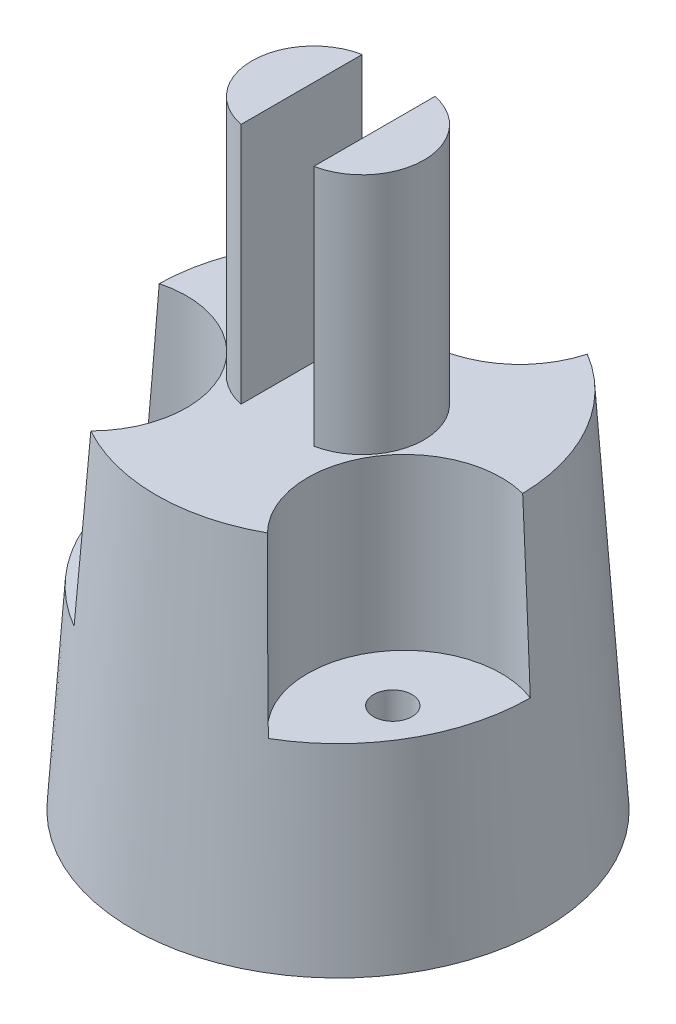
ISO-10303-21;
HEADER;
FILE_DESCRIPTION(('STEP AP214'),'2;1');
FILE_NAME('part.step','',(''),(''),'','','');
FILE_SCHEMA(('AUTOMOTIVE_DESIGN { 1 0 10303 214 1 1 1 1 }'));
ENDSEC;
DATA;
#1=APPLICATION_CONTEXT('core data for automotive mechanical design processes');
#2=APPLICATION_PROTOCOL_DEFINITION('international standard','automotive_design',2000,#1);
#3=PRODUCT_CONTEXT('',#1,'mechanical');
#4=PRODUCT('Part','Part','',(#3));
#5=PRODUCT_RELATED_PRODUCT_CATEGORY('part','',(#4));
#6=PRODUCT_DEFINITION_FORMATION('','',#4);
#7=PRODUCT_DEFINITION_CONTEXT('part definition',#1,'design');
#8=PRODUCT_DEFINITION('design','',#6,#7);
#9=PRODUCT_DEFINITION_SHAPE('','',#8);
#10=(LENGTH_UNIT() NAMED_UNIT(*) SI_UNIT(.MILLI.,.METRE.));
#11=(NAMED_UNIT(*) PLANE_ANGLE_UNIT() SI_UNIT($,.RADIAN.));
#12=(NAMED_UNIT(*) SI_UNIT($,.STERADIAN.) SOLID_ANGLE_UNIT());
#13=UNCERTAINTY_MEASURE_WITH_UNIT(LENGTH_MEASURE(1.E-05),#10,'distance_accuracy_value','');
#14=(GEOMETRIC_REPRESENTATION_CONTEXT(3) GLOBAL_UNCERTAINTY_ASSIGNED_CONTEXT((#13)) GLOBAL_UNIT_ASSIGNED_CONTEXT((#10,
#11,#12)) REPRESENTATION_CONTEXT('',''));
#15=CARTESIAN_POINT('',(0.,0.,0.));
#16=DIRECTION('',(0.,0.,1.));
#17=DIRECTION('',(1.,0.,0.));
#18=AXIS2_PLACEMENT_3D('',#15,#16,#17);
#19=CARTESIAN_POINT('',(3.5,15.,0.));
#20=DIRECTION('',(0.,-1.,0.));
#21=DIRECTION('',(1.,0.,0.));
#22=AXIS2_PLACEMENT_3D('',#19,#20,#21);
#23=PLANE('',#22);
#24=CARTESIAN_POINT('',(1.,15.,0.));
#25=DIRECTION('',(0.,1.,0.));
#26=DIRECTION('',(-1.,0.,0.));
#27=AXIS2_PLACEMENT_3D('',#24,#25,#26);
#28=CIRCLE('',#27,2.54950975679639);
#29=CARTESIAN_POINT('',(1.5,15.,2.5));
#30=VERTEX_POINT('',#29);
#31=CARTESIAN_POINT('',(1.5,15.,-2.5));
#32=VERTEX_POINT('',#31);
#33=EDGE_CURVE('E140',#30,#32,#28,.T.);
#34=ORIENTED_EDGE('',*,*,#33,.F.);
#35=DIRECTION('',(0.,0.,1.));
#36=VECTOR('',#35,1.);
#37=CARTESIAN_POINT('',(1.5,15.,-2.5));
#38=LINE('',#37,#36);
#39=EDGE_CURVE('E65',#32,#30,#38,.T.);
#40=ORIENTED_EDGE('',*,*,#39,.F.);
#41=EDGE_LOOP('',(#34,#40));
#42=FACE_BOUND('',#41,.T.);
#43=CARTESIAN_POINT('',(0.,15.,0.));
#44=DIRECTION('',(0.,1.,0.));
#45=DIRECTION('',(-1.,0.,0.));
#46=AXIS2_PLACEMENT_3D('',#43,#44,#45);
#47=CIRCLE('',#46,7.50000000000001);
#48=CARTESIAN_POINT('',(7.49900773698669,15.,-0.121995740146375));
#49=VERTEX_POINT('',#48);
#50=CARTESIAN_POINT('',(3.85515527861359,15.,-6.43333333333334));
#51=VERTEX_POINT('',#50);
#52=EDGE_CURVE('E243',#49,#51,#47,.T.);
#53=ORIENTED_EDGE('',*,*,#52,.T.);
#54=CARTESIAN_POINT('',(0.,15.,-7.5));
#55=DIRECTION('',(0.,1.,0.));
#56=DIRECTION('',(-1.,0.,0.));
#57=AXIS2_PLACEMENT_3D('',#54,#55,#56);
#58=CIRCLE('',#57,4.);
#59=CARTESIAN_POINT('',(-3.85515527861359,15.,-6.43333333333334));
#60=VERTEX_POINT('',#59);
#61=EDGE_CURVE('E171',#60,#51,#58,.T.);
#62=ORIENTED_EDGE('',*,*,#61,.F.);
#63=CARTESIAN_POINT('',(-7.49900773698669,15.,-0.121995740146375));
#64=VERTEX_POINT('',#63);
#65=EDGE_CURVE('E254',#60,#64,#47,.T.);
#66=ORIENTED_EDGE('',*,*,#65,.T.);
#67=CARTESIAN_POINT('',(-6.49519052838329,15.,3.75));
#68=DIRECTION('',(0.,1.,0.));
#69=DIRECTION('',(-1.,0.,0.));
#70=AXIS2_PLACEMENT_3D('',#67,#68,#69);
#71=CIRCLE('',#70,4.);
#72=CARTESIAN_POINT('',(-3.6438524583731,15.,6.55532907347972));
#73=VERTEX_POINT('',#72);
#74=EDGE_CURVE('E165',#73,#64,#71,.T.);
#75=ORIENTED_EDGE('',*,*,#74,.F.);
#76=CARTESIAN_POINT('',(3.6438524583731,15.,6.55532907347972));
#77=VERTEX_POINT('',#76);
#78=EDGE_CURVE('E51',#73,#77,#47,.T.);
#79=ORIENTED_EDGE('',*,*,#78,.T.);
#80=CARTESIAN_POINT('',(6.49519052838329,15.,3.75));
#81=DIRECTION('',(0.,1.,0.));
#82=DIRECTION('',(-1.,0.,0.));
#83=AXIS2_PLACEMENT_3D('',#80,#81,#82);
#84=CIRCLE('',#83,4.);
#85=EDGE_CURVE('E178',#49,#77,#84,.T.);
#86=ORIENTED_EDGE('',*,*,#85,.F.);
#87=EDGE_LOOP('',(#53,#62,#66,#75,#79,#86));
#88=FACE_BOUND('',#87,.T.);
#89=CARTESIAN_POINT('',(-1.,15.,0.));
#90=DIRECTION('',(0.,1.,0.));
#91=DIRECTION('',(1.,0.,0.));
#92=AXIS2_PLACEMENT_3D('',#89,#90,#91);
#93=CIRCLE('',#92,2.54950975679639);
#94=CARTESIAN_POINT('',(-1.5,15.,-2.5));
#95=VERTEX_POINT('',#94);
#96=CARTESIAN_POINT('',(-1.5,15.,2.5));
#97=VERTEX_POINT('',#96);
#98=EDGE_CURVE('E138',#95,#97,#93,.T.);
#99=ORIENTED_EDGE('',*,*,#98,.F.);
#100=DIRECTION('',(0.,0.,-1.));
#101=VECTOR('',#100,1.);
#102=CARTESIAN_POINT('',(-1.5,15.,-2.5));
#103=LINE('',#102,#101);
#104=EDGE_CURVE('E58',#97,#95,#103,.T.);
#105=ORIENTED_EDGE('',*,*,#104,.F.);
#106=EDGE_LOOP('',(#99,#105));
#107=FACE_BOUND('',#106,.T.);
#108=ADVANCED_FACE('F41',(#42,#88,#107),#23,.F.);
#109=CARTESIAN_POINT('',(0.0193509079697166,15.001,-6.24837003564615));
#110=DIRECTION('',(0.,-1.,0.));
#111=DIRECTION('',(1.,0.,0.));
#112=AXIS2_PLACEMENT_3D('',#109,#110,#111);
#113=CYLINDRICAL_SURFACE('',#112,0.793750000000001);
#114=CARTESIAN_POINT('',(0.0193509079697163,0.,-6.24837003564615));
#115=DIRECTION('',(0.,-1.,0.));
#116=DIRECTION('',(1.,0.,0.));
#117=AXIS2_PLACEMENT_3D('',#114,#115,#116);
#118=CIRCLE('',#117,0.793750000000001);
#119=CARTESIAN_POINT('',(0.813100907969717,0.,-6.24837003564615));
#120=VERTEX_POINT('',#119);
#121=EDGE_CURVE('E260',#120,#120,#118,.T.);
#122=ORIENTED_EDGE('',*,*,#121,.T.);
#123=EDGE_LOOP('',(#122));
#124=FACE_BOUND('',#123,.T.);
#125=CARTESIAN_POINT('',(0.0193509079697165,8.,-6.24837003564615));
#126=DIRECTION('',(0.,1.,0.));
#127=DIRECTION('',(-1.,0.,0.));
#128=AXIS2_PLACEMENT_3D('',#125,#126,#127);
#129=CIRCLE('',#128,0.793750000000001);
#130=CARTESIAN_POINT('',(-0.774399092030284,8.,-6.24837003564615));
#131=VERTEX_POINT('',#130);
#132=EDGE_CURVE('E45',#131,#131,#129,.F.);
#133=ORIENTED_EDGE('',*,*,#132,.F.);
#134=EDGE_LOOP('',(#133));
#135=FACE_BOUND('',#134,.T.);
#136=ADVANCED_FACE('F231',(#124,#135),#113,.F.);
#137=CARTESIAN_POINT('',(5.40157172913021,15.001,3.1409433957111));
#138=DIRECTION('',(0.,-1.,0.));
#139=DIRECTION('',(1.,0.,0.));
#140=AXIS2_PLACEMENT_3D('',#137,#138,#139);
#141=CYLINDRICAL_SURFACE('',#140,0.79375);
#142=CARTESIAN_POINT('',(5.40157172913021,0.,3.1409433957111));
#143=DIRECTION('',(0.,-1.,0.));
#144=DIRECTION('',(1.,0.,0.));
#145=AXIS2_PLACEMENT_3D('',#142,#143,#144);
#146=CIRCLE('',#145,0.79375);
#147=CARTESIAN_POINT('',(6.19532172913021,0.,3.1409433957111));
#148=VERTEX_POINT('',#147);
#149=EDGE_CURVE('E323',#148,#148,#146,.T.);
#150=ORIENTED_EDGE('',*,*,#149,.T.);
#151=EDGE_LOOP('',(#150));
#152=FACE_BOUND('',#151,.T.);
#153=CARTESIAN_POINT('',(5.40157172913021,8.,3.1409433957111));
#154=DIRECTION('',(0.,1.,0.));
#155=DIRECTION('',(-1.,0.,0.));
#156=AXIS2_PLACEMENT_3D('',#153,#154,#155);
#157=CIRCLE('',#156,0.79375);
#158=CARTESIAN_POINT('',(4.60782172913021,8.,3.1409433957111));
#159=VERTEX_POINT('',#158);
#160=EDGE_CURVE('E190',#159,#159,#157,.F.);
#161=ORIENTED_EDGE('',*,*,#160,.F.);
#162=EDGE_LOOP('',(#161));
#163=FACE_BOUND('',#162,.T.);
#164=ADVANCED_FACE('F227',(#152,#163),#141,.F.);
#165=CARTESIAN_POINT('',(-5.42092263709991,15.001,3.10742663993503));
#166=DIRECTION('',(0.,-1.,0.));
#167=DIRECTION('',(1.,0.,0.));
#168=AXIS2_PLACEMENT_3D('',#165,#166,#167);
#169=CYLINDRICAL_SURFACE('',#168,0.79375);
#170=CARTESIAN_POINT('',(-5.42092263709991,0.,3.10742663993503));
#171=DIRECTION('',(0.,-1.,0.));
#172=DIRECTION('',(1.,0.,0.));
#173=AXIS2_PLACEMENT_3D('',#170,#171,#172);
#174=CIRCLE('',#173,0.79375);
#175=CARTESIAN_POINT('',(-4.62717263709991,0.,3.10742663993503));
#176=VERTEX_POINT('',#175);
#177=EDGE_CURVE('E258',#176,#176,#174,.T.);
#178=ORIENTED_EDGE('',*,*,#177,.T.);
#179=EDGE_LOOP('',(#178));
#180=FACE_BOUND('',#179,.T.);
#181=CARTESIAN_POINT('',(-5.42092263709991,8.,3.10742663993503));
#182=DIRECTION('',(0.,1.,0.));
#183=DIRECTION('',(-1.,0.,0.));
#184=AXIS2_PLACEMENT_3D('',#181,#182,#183);
#185=CIRCLE('',#184,0.79375);
#186=CARTESIAN_POINT('',(-6.21467263709991,8.,3.10742663993503));
#187=VERTEX_POINT('',#186);
#188=EDGE_CURVE('E170',#187,#187,#185,.F.);
#189=ORIENTED_EDGE('',*,*,#188,.F.);
#190=EDGE_LOOP('',(#189));
#191=FACE_BOUND('',#190,.T.);
#192=ADVANCED_FACE('F223',(#180,#191),#169,.F.);
#193=CARTESIAN_POINT('',(0.,0.,0.));
#194=DIRECTION('',(0.,1.,0.));
#195=DIRECTION('',(-1.,0.,0.));
#196=AXIS2_PLACEMENT_3D('',#193,#194,#195);
#197=PLANE('',#196);
#198=ORIENTED_EDGE('',*,*,#177,.F.);
#199=EDGE_LOOP('',(#198));
#200=FACE_BOUND('',#199,.T.);
#201=ORIENTED_EDGE('',*,*,#149,.F.);
#202=EDGE_LOOP('',(#201));
#203=FACE_BOUND('',#202,.T.);
#204=ORIENTED_EDGE('',*,*,#121,.F.);
#205=EDGE_LOOP('',(#204));
#206=FACE_BOUND('',#205,.T.);
#207=CARTESIAN_POINT('',(0.,0.,0.));
#208=DIRECTION('',(0.,1.,0.));
#209=DIRECTION('',(-1.,0.,0.));
#210=AXIS2_PLACEMENT_3D('',#207,#208,#209);
#211=CIRCLE('',#210,8.496);
#212=CARTESIAN_POINT('',(-8.496,0.,0.));
#213=VERTEX_POINT('',#212);
#214=EDGE_CURVE('E11',#213,#213,#211,.T.);
#215=ORIENTED_EDGE('',*,*,#214,.F.);
#216=EDGE_LOOP('',(#215));
#217=FACE_BOUND('',#216,.T.);
#218=ADVANCED_FACE('F43',(#200,#203,#206,#217),#197,.F.);
#219=CARTESIAN_POINT('',(0.,0.,0.));
#220=DIRECTION('',(0.,-1.,0.));
#221=DIRECTION('',(1.,0.,0.));
#222=AXIS2_PLACEMENT_3D('',#219,#220,#221);
#223=CONICAL_SURFACE('',#222,8.496,0.0663026723574343);
#224=ORIENTED_EDGE('',*,*,#65,.F.);
#225=CARTESIAN_POINT('',(-3.85515160420499,15.0002,-6.4333200533451));
#226=CARTESIAN_POINT('',(-3.86586969963817,14.4167864573635,-6.47205864257984));
#227=CARTESIAN_POINT('',(-3.87604298881614,13.8333827330451,-6.51109671958238));
#228=CARTESIAN_POINT('',(-3.89526952704113,12.6666000873914,-6.58977143102155));
#229=CARTESIAN_POINT('',(-3.90432278160896,12.0832211659482,-6.62940806250673));
#230=CARTESIAN_POINT('',(-3.9212789297579,10.9164875062894,-6.70927984907834));
#231=CARTESIAN_POINT('',(-3.92918182327126,10.3331327680754,-6.74951500420002));
#232=CARTESIAN_POINT('',(-3.94380239748833,9.16644714604202,-6.83058378093313));
#233=CARTESIAN_POINT('',(-3.95052007234935,8.58311626235446,-6.87141740549372));
#234=CARTESIAN_POINT('',(-3.95662767307486,7.9998,-6.91255003901763));
#235=B_SPLINE_CURVE_WITH_KNOTS('',3,(#225,#226,#227,#228,#229,#230,#231,#232,#233,#234),
.UNSPECIFIED.,.F.,.F.,(4,2,2,2,4),(0.,1.75438917948509,3.50876971097777,5.26315034581012,
7.01753962887176),.UNSPECIFIED.);
#236=CARTESIAN_POINT('',(-3.95662557914046,8.,-6.912535936));
#237=VERTEX_POINT('',#236);
#238=EDGE_CURVE('E288',#60,#237,#235,.T.);
#239=ORIENTED_EDGE('',*,*,#238,.T.);
#240=CARTESIAN_POINT('',(0.,8.,0.));
#241=DIRECTION('',(0.,1.,0.));
#242=DIRECTION('',(-1.,0.,0.));
#243=AXIS2_PLACEMENT_3D('',#240,#241,#242);
#244=CIRCLE('',#243,7.9648);
#245=CARTESIAN_POINT('',(3.95662557914046,8.,-6.91253593600001));
#246=VERTEX_POINT('',#245);
#247=EDGE_CURVE('E194',#246,#237,#244,.T.);
#248=ORIENTED_EDGE('',*,*,#247,.F.);
#249=CARTESIAN_POINT('',(3.95662767307486,7.9998,-6.91255003901763));
#250=CARTESIAN_POINT('',(3.95052007234934,8.58311626235446,-6.87141740549372));
#251=CARTESIAN_POINT('',(3.94380239748833,9.16644714604202,-6.83058378093313));
#252=CARTESIAN_POINT('',(3.92918182327125,10.3331327680754,-6.74951500420003));
#253=CARTESIAN_POINT('',(3.9212789297579,10.9164875062894,-6.70927984907834));
#254=CARTESIAN_POINT('',(3.90432278160896,12.0832211659482,-6.62940806250673));
#255=CARTESIAN_POINT('',(3.89526952704113,12.6666000873914,-6.58977143102155));
#256=CARTESIAN_POINT('',(3.87604298881614,13.8333827330451,-6.51109671958238));
#257=CARTESIAN_POINT('',(3.86586969963817,14.4167864573635,-6.47205864257984));
#258=CARTESIAN_POINT('',(3.85515160420499,15.0002,-6.4333200533451));
#259=B_SPLINE_CURVE_WITH_KNOTS('',3,(#249,#250,#251,#252,#253,#254,#255,#256,#257,#258),
.UNSPECIFIED.,.F.,.F.,(4,2,2,2,4),(0.,1.75438928306164,3.508769917894,5.26315044938667,
7.01753962887176),.UNSPECIFIED.);
#260=EDGE_CURVE('E284',#246,#51,#259,.T.);
#261=ORIENTED_EDGE('',*,*,#260,.T.);
#262=ORIENTED_EDGE('',*,*,#52,.F.);
#263=CARTESIAN_POINT('',(7.49899439897521,15.0002,-0.121999198009303));
#264=CARTESIAN_POINT('',(7.53790204907586,14.4167864573635,-0.111912046317248));
#265=CARTESIAN_POINT('',(7.57679666006394,13.8333827330451,-0.101203334684149));
#266=CARTESIAN_POINT('',(7.65454422791816,12.6666000873914,-0.0785166494942378));
#267=CARTESIAN_POINT('',(7.69339718498868,12.0832211659482,-0.0665386821943187));
#268=CARTESIAN_POINT('',(7.77104625527982,10.9164875062894,-0.0412872439558319));
#269=CARTESIAN_POINT('',(7.80984236849708,10.3331327680754,-0.0280137729409541));
#270=CARTESIAN_POINT('',(7.88736027571022,9.16644714604202,-0.000141173264301441));
#271=CARTESIAN_POINT('',(7.92608206933879,8.58311626235446,0.0144579619319878));
#272=CARTESIAN_POINT('',(7.96475777525781,7.9998,0.02973494130947));
#273=B_SPLINE_CURVE_WITH_KNOTS('',3,(#263,#264,#265,#266,#267,#268,#269,#270,#271,#272),
.UNSPECIFIED.,.F.,.F.,(4,2,2,2,4),(0.,1.75438917948509,3.50876971097776,5.26315034581012,
7.01753962887176),.UNSPECIFIED.);
#274=CARTESIAN_POINT('',(7.96474451471908,8.,0.0297297032010439));
#275=VERTEX_POINT('',#274);
#276=EDGE_CURVE('E280',#49,#275,#273,.T.);
#277=ORIENTED_EDGE('',*,*,#276,.T.);
#278=CARTESIAN_POINT('',(0.,8.,0.));
#279=DIRECTION('',(0.,1.,0.));
#280=DIRECTION('',(-1.,0.,0.));
#281=AXIS2_PLACEMENT_3D('',#278,#279,#280);
#282=CIRCLE('',#281,7.9648);
#283=CARTESIAN_POINT('',(4.00811893557861,8.,6.88280623279896));
#284=VERTEX_POINT('',#283);
#285=EDGE_CURVE('E191',#284,#275,#282,.T.);
#286=ORIENTED_EDGE('',*,*,#285,.F.);
#287=CARTESIAN_POINT('',(4.00813010218295,7.9998,6.88281509770816));
#288=CARTESIAN_POINT('',(3.97556199698945,8.58311626235446,6.85695944356173));
#289=CARTESIAN_POINT('',(3.94355787822189,9.16644714604202,6.83072495419743));
#290=CARTESIAN_POINT('',(3.88066054522583,10.3331327680754,6.77752877714098));
#291=CARTESIAN_POINT('',(3.84976732552191,10.9164875062894,6.75056709303417));
#292=CARTESIAN_POINT('',(3.78907440337972,12.0832211659482,6.69594674470105));
#293=CARTESIAN_POINT('',(3.75927470087703,12.6666000873914,6.66828808051579));
#294=CARTESIAN_POINT('',(3.7007536712478,13.8333827330451,6.61230005426653));
#295=CARTESIAN_POINT('',(3.67203234943769,14.4167864573635,6.58397068889709));
#296=CARTESIAN_POINT('',(3.64384279477022,15.0002,6.5553192513544));
#297=B_SPLINE_CURVE_WITH_KNOTS('',3,(#287,#288,#289,#290,#291,#292,#293,#294,#295,#296),
.UNSPECIFIED.,.F.,.F.,(4,2,2,2,4),(0.,1.75438928306163,3.508769917894,5.26315044938667,
7.01753962887176),.UNSPECIFIED.);
#298=EDGE_CURVE('E281',#284,#77,#297,.T.);
#299=ORIENTED_EDGE('',*,*,#298,.T.);
#300=ORIENTED_EDGE('',*,*,#78,.F.);
#301=CARTESIAN_POINT('',(-3.64384279477022,15.0002,6.5553192513544));
#302=CARTESIAN_POINT('',(-3.67203234943769,14.4167864573635,6.58397068889709));
#303=CARTESIAN_POINT('',(-3.7007536712478,13.8333827330451,6.61230005426653));
#304=CARTESIAN_POINT('',(-3.75927470087703,12.6666000873914,6.66828808051579));
#305=CARTESIAN_POINT('',(-3.78907440337972,12.0832211659482,6.69594674470105));
#306=CARTESIAN_POINT('',(-3.84976732552191,10.9164875062894,6.75056709303417));
#307=CARTESIAN_POINT('',(-3.88066054522583,10.3331327680754,6.77752877714098));
#308=CARTESIAN_POINT('',(-3.94355787822189,9.16644714604202,6.83072495419743));
#309=CARTESIAN_POINT('',(-3.97556199698945,8.58311626235446,6.85695944356173));
#310=CARTESIAN_POINT('',(-4.00813010218295,7.9998,6.88281509770815));
#311=B_SPLINE_CURVE_WITH_KNOTS('',3,(#301,#302,#303,#304,#305,#306,#307,#308,#309,#310),
.UNSPECIFIED.,.F.,.F.,(4,2,2,2,4),(0.,1.75438917948509,3.50876971097776,5.26315034581012,
7.01753962887176),.UNSPECIFIED.);
#312=CARTESIAN_POINT('',(-4.00811893557861,8.,6.88280623279896));
#313=VERTEX_POINT('',#312);
#314=EDGE_CURVE('E206',#73,#313,#311,.T.);
#315=ORIENTED_EDGE('',*,*,#314,.T.);
#316=CARTESIAN_POINT('',(0.,8.,0.));
#317=DIRECTION('',(0.,1.,0.));
#318=DIRECTION('',(-1.,0.,0.));
#319=AXIS2_PLACEMENT_3D('',#316,#317,#318);
#320=CIRCLE('',#319,7.9648);
#321=CARTESIAN_POINT('',(-7.96474451471908,8.,0.0297297032010439));
#322=VERTEX_POINT('',#321);
#323=EDGE_CURVE('E187',#322,#313,#320,.T.);
#324=ORIENTED_EDGE('',*,*,#323,.F.);
#325=CARTESIAN_POINT('',(-7.96475777525781,7.9998,0.0297349413094712));
#326=CARTESIAN_POINT('',(-7.92608206933879,8.58311626235446,0.0144579619319899));
#327=CARTESIAN_POINT('',(-7.88736027571022,9.16644714604202,-0.000141173264299668));
#328=CARTESIAN_POINT('',(-7.80984236849708,10.3331327680754,-0.0280137729409534));
#329=CARTESIAN_POINT('',(-7.77104625527982,10.9164875062894,-0.0412872439558319));
#330=CARTESIAN_POINT('',(-7.69339718498868,12.0832211659482,-0.0665386821943188));
#331=CARTESIAN_POINT('',(-7.65454422791816,12.6666000873914,-0.0785166494942372));
#332=CARTESIAN_POINT('',(-7.57679666006394,13.8333827330451,-0.101203334684147));
#333=CARTESIAN_POINT('',(-7.53790204907586,14.4167864573635,-0.111912046317247));
#334=CARTESIAN_POINT('',(-7.49899439897521,15.0002,-0.121999198009302));
#335=B_SPLINE_CURVE_WITH_KNOTS('',3,(#325,#326,#327,#328,#329,#330,#331,#332,#333,#334),
.UNSPECIFIED.,.F.,.F.,(4,2,2,2,4),(0.,1.75438928306163,3.508769917894,5.26315044938667,
7.01753962887176),.UNSPECIFIED.);
#336=EDGE_CURVE('E197',#322,#64,#335,.T.);
#337=ORIENTED_EDGE('',*,*,#336,.T.);
#338=EDGE_LOOP('',(#224,#239,#248,#261,#262,#277,#286,#299,#300,#315,#324,#337));
#339=FACE_BOUND('',#338,.T.);
#340=ORIENTED_EDGE('',*,*,#214,.T.);
#341=EDGE_LOOP('',(#340));
#342=FACE_BOUND('',#341,.T.);
#343=ADVANCED_FACE('F212',(#339,#342),#223,.T.);
#344=CARTESIAN_POINT('',(-6.49519052838329,8.,3.75));
#345=DIRECTION('',(0.,1.,0.));
#346=DIRECTION('',(-1.,0.,0.));
#347=AXIS2_PLACEMENT_3D('',#344,#345,#346);
#348=CYLINDRICAL_SURFACE('',#347,4.);
#349=ORIENTED_EDGE('',*,*,#74,.T.);
#350=ORIENTED_EDGE('',*,*,#336,.F.);
#351=CARTESIAN_POINT('',(-6.49519052838329,8.,3.75));
#352=DIRECTION('',(0.,1.,0.));
#353=DIRECTION('',(-1.,0.,0.));
#354=AXIS2_PLACEMENT_3D('',#351,#352,#353);
#355=CIRCLE('',#354,4.);
#356=EDGE_CURVE('E181',#313,#322,#355,.T.);
#357=ORIENTED_EDGE('',*,*,#356,.F.);
#358=ORIENTED_EDGE('',*,*,#314,.F.);
#359=EDGE_LOOP('',(#349,#350,#357,#358));
#360=FACE_BOUND('',#359,.T.);
#361=ADVANCED_FACE('F215',(#360),#348,.F.);
#362=CARTESIAN_POINT('',(-6.49519052838329,8.,3.75));
#363=DIRECTION('',(0.,1.,0.));
#364=DIRECTION('',(-1.,0.,0.));
#365=AXIS2_PLACEMENT_3D('',#362,#363,#364);
#366=PLANE('',#365);
#367=ORIENTED_EDGE('',*,*,#188,.T.);
#368=EDGE_LOOP('',(#367));
#369=FACE_BOUND('',#368,.T.);
#370=ORIENTED_EDGE('',*,*,#323,.T.);
#371=ORIENTED_EDGE('',*,*,#356,.T.);
#372=EDGE_LOOP('',(#370,#371));
#373=FACE_BOUND('',#372,.T.);
#374=ADVANCED_FACE('F220',(#369,#373),#366,.T.);
#375=CARTESIAN_POINT('',(6.49519052838329,8.,3.75));
#376=DIRECTION('',(0.,1.,0.));
#377=DIRECTION('',(-1.,0.,0.));
#378=AXIS2_PLACEMENT_3D('',#375,#376,#377);
#379=CYLINDRICAL_SURFACE('',#378,4.);
#380=ORIENTED_EDGE('',*,*,#85,.T.);
#381=ORIENTED_EDGE('',*,*,#298,.F.);
#382=CARTESIAN_POINT('',(6.49519052838329,8.,3.75));
#383=DIRECTION('',(0.,1.,0.));
#384=DIRECTION('',(-1.,0.,0.));
#385=AXIS2_PLACEMENT_3D('',#382,#383,#384);
#386=CIRCLE('',#385,4.);
#387=EDGE_CURVE('E174',#275,#284,#386,.T.);
#388=ORIENTED_EDGE('',*,*,#387,.F.);
#389=ORIENTED_EDGE('',*,*,#276,.F.);
#390=EDGE_LOOP('',(#380,#381,#388,#389));
#391=FACE_BOUND('',#390,.T.);
#392=ADVANCED_FACE('F274',(#391),#379,.F.);
#393=CARTESIAN_POINT('',(6.49519052838329,8.,3.75));
#394=DIRECTION('',(0.,1.,0.));
#395=DIRECTION('',(-1.,0.,0.));
#396=AXIS2_PLACEMENT_3D('',#393,#394,#395);
#397=PLANE('',#396);
#398=ORIENTED_EDGE('',*,*,#160,.T.);
#399=EDGE_LOOP('',(#398));
#400=FACE_BOUND('',#399,.T.);
#401=ORIENTED_EDGE('',*,*,#285,.T.);
#402=ORIENTED_EDGE('',*,*,#387,.T.);
#403=EDGE_LOOP('',(#401,#402));
#404=FACE_BOUND('',#403,.T.);
#405=ADVANCED_FACE('F269',(#400,#404),#397,.T.);
#406=CARTESIAN_POINT('',(0.,8.,-7.5));
#407=DIRECTION('',(0.,1.,0.));
#408=DIRECTION('',(-1.,0.,0.));
#409=AXIS2_PLACEMENT_3D('',#406,#407,#408);
#410=CYLINDRICAL_SURFACE('',#409,4.);
#411=ORIENTED_EDGE('',*,*,#61,.T.);
#412=ORIENTED_EDGE('',*,*,#260,.F.);
#413=CARTESIAN_POINT('',(0.,8.,-7.5));
#414=DIRECTION('',(0.,1.,0.));
#415=DIRECTION('',(-1.,0.,0.));
#416=AXIS2_PLACEMENT_3D('',#413,#414,#415);
#417=CIRCLE('',#416,4.);
#418=EDGE_CURVE('E166',#237,#246,#417,.T.);
#419=ORIENTED_EDGE('',*,*,#418,.F.);
#420=ORIENTED_EDGE('',*,*,#238,.F.);
#421=EDGE_LOOP('',(#411,#412,#419,#420));
#422=FACE_BOUND('',#421,.T.);
#423=ADVANCED_FACE('F273',(#422),#410,.F.);
#424=CARTESIAN_POINT('',(0.,8.,-7.5));
#425=DIRECTION('',(0.,1.,0.));
#426=DIRECTION('',(-1.,0.,0.));
#427=AXIS2_PLACEMENT_3D('',#424,#425,#426);
#428=PLANE('',#427);
#429=ORIENTED_EDGE('',*,*,#132,.T.);
#430=EDGE_LOOP('',(#429));
#431=FACE_BOUND('',#430,.T.);
#432=ORIENTED_EDGE('',*,*,#247,.T.);
#433=ORIENTED_EDGE('',*,*,#418,.T.);
#434=EDGE_LOOP('',(#432,#433));
#435=FACE_BOUND('',#434,.T.);
#436=ADVANCED_FACE('F310',(#431,#435),#428,.T.);
#437=CARTESIAN_POINT('',(0.999999999999999,25.,0.));
#438=DIRECTION('',(0.,-1.,0.));
#439=DIRECTION('',(1.,0.,0.));
#440=AXIS2_PLACEMENT_3D('',#437,#438,#439);
#441=CYLINDRICAL_SURFACE('',#440,2.54950975679639);
#442=ORIENTED_EDGE('',*,*,#33,.T.);
#443=DIRECTION('',(0.,-1.,0.));
#444=VECTOR('',#443,1.);
#445=CARTESIAN_POINT('',(1.5,25.,-2.5));
#446=LINE('',#445,#444);
#447=CARTESIAN_POINT('',(1.5,25.,-2.5));
#448=VERTEX_POINT('',#447);
#449=EDGE_CURVE('E162',#448,#32,#446,.T.);
#450=ORIENTED_EDGE('',*,*,#449,.F.);
#451=CARTESIAN_POINT('',(0.999999999999999,25.,0.));
#452=DIRECTION('',(0.,1.,0.));
#453=DIRECTION('',(-1.,0.,0.));
#454=AXIS2_PLACEMENT_3D('',#451,#452,#453);
#455=CIRCLE('',#454,2.54950975679639);
#456=CARTESIAN_POINT('',(1.5,25.,2.5));
#457=VERTEX_POINT('',#456);
#458=EDGE_CURVE('E149',#457,#448,#455,.T.);
#459=ORIENTED_EDGE('',*,*,#458,.F.);
#460=DIRECTION('',(0.,-1.,0.));
#461=VECTOR('',#460,1.);
#462=CARTESIAN_POINT('',(1.5,25.,2.5));
#463=LINE('',#462,#461);
#464=EDGE_CURVE('E155',#457,#30,#463,.T.);
#465=ORIENTED_EDGE('',*,*,#464,.T.);
#466=EDGE_LOOP('',(#442,#450,#459,#465));
#467=FACE_BOUND('',#466,.T.);
#468=ADVANCED_FACE('F370',(#467),#441,.T.);
#469=CARTESIAN_POINT('',(1.5,25.,-2.5));
#470=DIRECTION('',(1.,0.,0.));
#471=DIRECTION('',(0.,0.,-1.));
#472=AXIS2_PLACEMENT_3D('',#469,#470,#471);
#473=PLANE('',#472);
#474=ORIENTED_EDGE('',*,*,#39,.T.);
#475=ORIENTED_EDGE('',*,*,#464,.F.);
#476=DIRECTION('',(0.,0.,1.));
#477=VECTOR('',#476,1.);
#478=CARTESIAN_POINT('',(1.5,25.,-2.5));
#479=LINE('',#478,#477);
#480=EDGE_CURVE('E153',#448,#457,#479,.T.);
#481=ORIENTED_EDGE('',*,*,#480,.F.);
#482=ORIENTED_EDGE('',*,*,#449,.T.);
#483=EDGE_LOOP('',(#474,#475,#481,#482));
#484=FACE_BOUND('',#483,.T.);
#485=ADVANCED_FACE('F377',(#484),#473,.F.);
#486=CARTESIAN_POINT('',(0.999999999999999,25.,0.));
#487=DIRECTION('',(0.,1.,0.));
#488=DIRECTION('',(-1.,0.,0.));
#489=AXIS2_PLACEMENT_3D('',#486,#487,#488);
#490=PLANE('',#489);
#491=ORIENTED_EDGE('',*,*,#458,.T.);
#492=ORIENTED_EDGE('',*,*,#480,.T.);
#493=EDGE_LOOP('',(#491,#492));
#494=FACE_BOUND('',#493,.T.);
#495=ADVANCED_FACE('F384',(#494),#490,.T.);
#496=CARTESIAN_POINT('',(-1.,25.,0.));
#497=DIRECTION('',(0.,-1.,0.));
#498=DIRECTION('',(1.,0.,0.));
#499=AXIS2_PLACEMENT_3D('',#496,#497,#498);
#500=CYLINDRICAL_SURFACE('',#499,2.54950975679639);
#501=ORIENTED_EDGE('',*,*,#98,.T.);
#502=DIRECTION('',(0.,-1.,0.));
#503=VECTOR('',#502,1.);
#504=CARTESIAN_POINT('',(-1.5,25.,2.5));
#505=LINE('',#504,#503);
#506=CARTESIAN_POINT('',(-1.5,25.,2.5));
#507=VERTEX_POINT('',#506);
#508=EDGE_CURVE('E124',#507,#97,#505,.T.);
#509=ORIENTED_EDGE('',*,*,#508,.F.);
#510=CARTESIAN_POINT('',(-1.,25.,0.));
#511=DIRECTION('',(0.,1.,0.));
#512=DIRECTION('',(1.,0.,0.));
#513=AXIS2_PLACEMENT_3D('',#510,#511,#512);
#514=CIRCLE('',#513,2.54950975679639);
#515=CARTESIAN_POINT('',(-1.5,25.,-2.5));
#516=VERTEX_POINT('',#515);
#517=EDGE_CURVE('E131',#516,#507,#514,.T.);
#518=ORIENTED_EDGE('',*,*,#517,.F.);
#519=DIRECTION('',(0.,-1.,0.));
#520=VECTOR('',#519,1.);
#521=CARTESIAN_POINT('',(-1.5,25.,-2.5));
#522=LINE('',#521,#520);
#523=EDGE_CURVE('E127',#516,#95,#522,.T.);
#524=ORIENTED_EDGE('',*,*,#523,.T.);
#525=EDGE_LOOP('',(#501,#509,#518,#524));
#526=FACE_BOUND('',#525,.T.);
#527=ADVANCED_FACE('F137',(#526),#500,.T.);
#528=CARTESIAN_POINT('',(-1.5,25.,-2.5));
#529=DIRECTION('',(-1.,0.,0.));
#530=DIRECTION('',(0.,0.,1.));
#531=AXIS2_PLACEMENT_3D('',#528,#529,#530);
#532=PLANE('',#531);
#533=ORIENTED_EDGE('',*,*,#104,.T.);
#534=ORIENTED_EDGE('',*,*,#523,.F.);
#535=DIRECTION('',(0.,0.,-1.));
#536=VECTOR('',#535,1.);
#537=CARTESIAN_POINT('',(-1.5,25.,-2.5));
#538=LINE('',#537,#536);
#539=EDGE_CURVE('E120',#507,#516,#538,.T.);
#540=ORIENTED_EDGE('',*,*,#539,.F.);
#541=ORIENTED_EDGE('',*,*,#508,.T.);
#542=EDGE_LOOP('',(#533,#534,#540,#541));
#543=FACE_BOUND('',#542,.T.);
#544=ADVANCED_FACE('F122',(#543),#532,.F.);
#545=CARTESIAN_POINT('',(-1.,25.,0.));
#546=DIRECTION('',(0.,-1.,0.));
#547=DIRECTION('',(1.,0.,0.));
#548=AXIS2_PLACEMENT_3D('',#545,#546,#547);
#549=PLANE('',#548);
#550=ORIENTED_EDGE('',*,*,#517,.T.);
#551=ORIENTED_EDGE('',*,*,#539,.T.);
#552=EDGE_LOOP('',(#550,#551));
#553=FACE_BOUND('',#552,.T.);
#554=ADVANCED_FACE('F133',(#553),#549,.F.);
#555=CLOSED_SHELL('',(#108,#136,#164,#192,#218,#343,#361,#374,#392,#405,#423,#436,#468,#485,
#495,#527,#544,#554));
#556=MANIFOLD_SOLID_BREP('B2',#555);
#557=ADVANCED_BREP_SHAPE_REPRESENTATION('',(#18,#556),#14);
#558=SHAPE_DEFINITION_REPRESENTATION(#9,#557);
ENDSEC;
END-ISO-10303-21;
